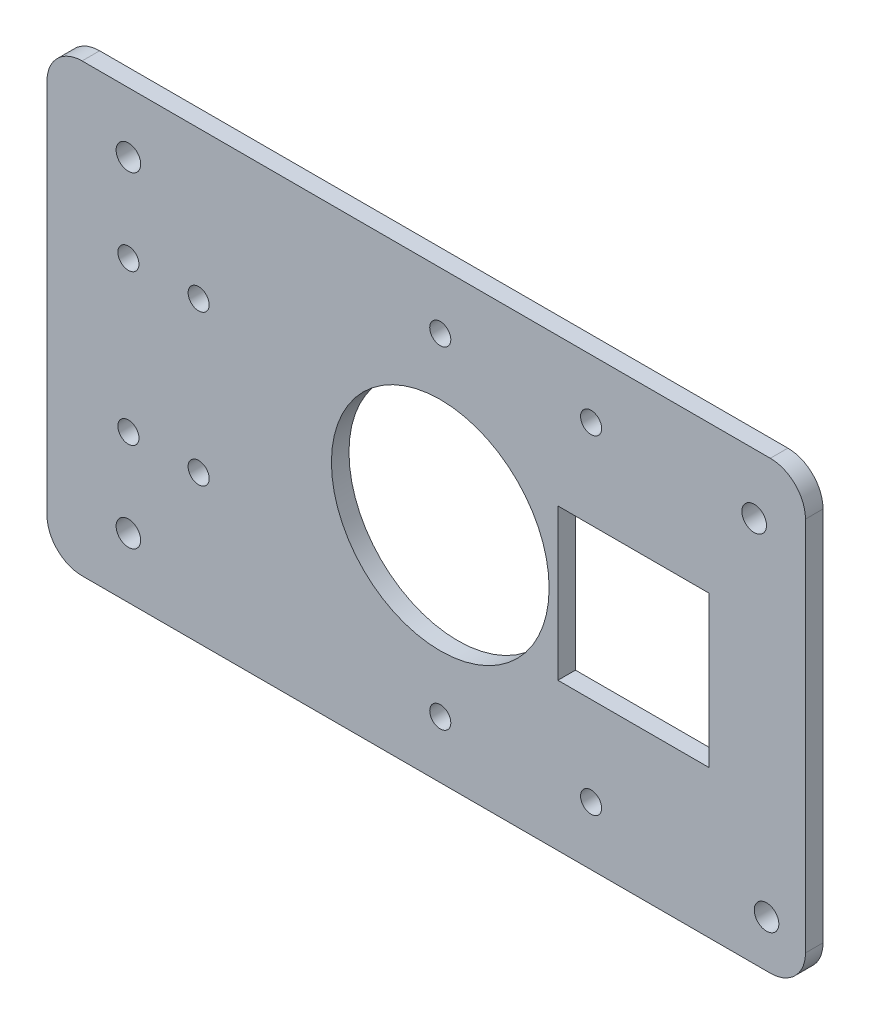
ISO-10303-21;
HEADER;
FILE_DESCRIPTION(('STEP AP214'),'2;1');
FILE_NAME('part.step','',(''),(''),'','','');
FILE_SCHEMA(('AUTOMOTIVE_DESIGN { 1 0 10303 214 1 1 1 1 }'));
ENDSEC;
DATA;
#1=APPLICATION_CONTEXT('core data for automotive mechanical design processes');
#2=APPLICATION_PROTOCOL_DEFINITION('international standard','automotive_design',2000,#1);
#3=PRODUCT_CONTEXT('',#1,'mechanical');
#4=PRODUCT('Part','Part','',(#3));
#5=PRODUCT_RELATED_PRODUCT_CATEGORY('part','',(#4));
#6=PRODUCT_DEFINITION_FORMATION('','',#4);
#7=PRODUCT_DEFINITION_CONTEXT('part definition',#1,'design');
#8=PRODUCT_DEFINITION('design','',#6,#7);
#9=PRODUCT_DEFINITION_SHAPE('','',#8);
#10=(LENGTH_UNIT() NAMED_UNIT(*) SI_UNIT(.MILLI.,.METRE.));
#11=(NAMED_UNIT(*) PLANE_ANGLE_UNIT() SI_UNIT($,.RADIAN.));
#12=(NAMED_UNIT(*) SI_UNIT($,.STERADIAN.) SOLID_ANGLE_UNIT());
#13=UNCERTAINTY_MEASURE_WITH_UNIT(LENGTH_MEASURE(1.E-05),#10,'distance_accuracy_value','');
#14=(GEOMETRIC_REPRESENTATION_CONTEXT(3) GLOBAL_UNCERTAINTY_ASSIGNED_CONTEXT((#13)) GLOBAL_UNIT_ASSIGNED_CONTEXT((#10,
#11,#12)) REPRESENTATION_CONTEXT('',''));
#15=CARTESIAN_POINT('',(0.,0.,0.));
#16=DIRECTION('',(0.,0.,1.));
#17=DIRECTION('',(1.,0.,0.));
#18=AXIS2_PLACEMENT_3D('',#15,#16,#17);
#19=CARTESIAN_POINT('',(0.,0.,10.));
#20=DIRECTION('',(0.,0.,-1.));
#21=DIRECTION('',(-1.,0.,0.));
#22=AXIS2_PLACEMENT_3D('',#19,#20,#21);
#23=PLANE('',#22);
#24=CARTESIAN_POINT('',(-98.,53.5,10.));
#25=DIRECTION('',(0.,0.,-1.));
#26=DIRECTION('',(-1.,0.,0.));
#27=AXIS2_PLACEMENT_3D('',#24,#25,#26);
#28=CIRCLE('',#27,10.);
#29=CARTESIAN_POINT('',(-98.,63.5,10.));
#30=VERTEX_POINT('',#29);
#31=CARTESIAN_POINT('',(-108.,53.5,10.));
#32=VERTEX_POINT('',#31);
#33=EDGE_CURVE('E173',#30,#32,#28,.F.);
#34=ORIENTED_EDGE('',*,*,#33,.T.);
#35=DIRECTION('',(0.,1.,0.));
#36=VECTOR('',#35,1.);
#37=CARTESIAN_POINT('',(-108.,63.5,10.));
#38=LINE('',#37,#36);
#39=CARTESIAN_POINT('',(-108.,-53.5,10.));
#40=VERTEX_POINT('',#39);
#41=EDGE_CURVE('E540',#40,#32,#38,.T.);
#42=ORIENTED_EDGE('',*,*,#41,.F.);
#43=CARTESIAN_POINT('',(-98.,-53.5,10.));
#44=DIRECTION('',(0.,0.,-1.));
#45=DIRECTION('',(-1.,0.,0.));
#46=AXIS2_PLACEMENT_3D('',#43,#44,#45);
#47=CIRCLE('',#46,10.);
#48=CARTESIAN_POINT('',(-98.,-63.5,10.));
#49=VERTEX_POINT('',#48);
#50=EDGE_CURVE('E177',#40,#49,#47,.F.);
#51=ORIENTED_EDGE('',*,*,#50,.T.);
#52=DIRECTION('',(-1.,0.,0.));
#53=VECTOR('',#52,1.);
#54=CARTESIAN_POINT('',(-108.,-63.5,10.));
#55=LINE('',#54,#53);
#56=CARTESIAN_POINT('',(98.,-63.5,10.));
#57=VERTEX_POINT('',#56);
#58=EDGE_CURVE('E244',#57,#49,#55,.T.);
#59=ORIENTED_EDGE('',*,*,#58,.F.);
#60=CARTESIAN_POINT('',(98.0000000000001,-53.5,10.));
#61=DIRECTION('',(0.,0.,-1.));
#62=DIRECTION('',(-1.,0.,0.));
#63=AXIS2_PLACEMENT_3D('',#60,#61,#62);
#64=CIRCLE('',#63,10.);
#65=CARTESIAN_POINT('',(108.,-53.5,10.));
#66=VERTEX_POINT('',#65);
#67=EDGE_CURVE('E183',#57,#66,#64,.F.);
#68=ORIENTED_EDGE('',*,*,#67,.T.);
#69=DIRECTION('',(0.,-1.,0.));
#70=VECTOR('',#69,1.);
#71=CARTESIAN_POINT('',(108.,63.5,10.));
#72=LINE('',#71,#70);
#73=CARTESIAN_POINT('',(108.,53.5,10.));
#74=VERTEX_POINT('',#73);
#75=EDGE_CURVE('E247',#74,#66,#72,.T.);
#76=ORIENTED_EDGE('',*,*,#75,.F.);
#77=CARTESIAN_POINT('',(98.,53.5,10.));
#78=DIRECTION('',(0.,0.,-1.));
#79=DIRECTION('',(-1.,0.,0.));
#80=AXIS2_PLACEMENT_3D('',#77,#78,#79);
#81=CIRCLE('',#80,10.);
#82=CARTESIAN_POINT('',(98.,63.5,10.));
#83=VERTEX_POINT('',#82);
#84=EDGE_CURVE('E180',#74,#83,#81,.F.);
#85=ORIENTED_EDGE('',*,*,#84,.T.);
#86=DIRECTION('',(1.,0.,0.));
#87=VECTOR('',#86,1.);
#88=CARTESIAN_POINT('',(-108.,63.5,10.));
#89=LINE('',#88,#87);
#90=EDGE_CURVE('E534',#30,#83,#89,.T.);
#91=ORIENTED_EDGE('',*,*,#90,.F.);
#92=EDGE_LOOP('',(#34,#42,#51,#59,#68,#76,#85,#91));
#93=FACE_BOUND('',#92,.T.);
#94=DIRECTION('',(-1.,0.,0.));
#95=VECTOR('',#94,1.);
#96=CARTESIAN_POINT('',(37.5000000000001,21.5,10.));
#97=LINE('',#96,#95);
#98=CARTESIAN_POINT('',(80.5000000000001,21.5,10.));
#99=VERTEX_POINT('',#98);
#100=CARTESIAN_POINT('',(37.5000000000001,21.5,10.));
#101=VERTEX_POINT('',#100);
#102=EDGE_CURVE('E138',#99,#101,#97,.T.);
#103=ORIENTED_EDGE('',*,*,#102,.F.);
#104=DIRECTION('',(0.,-1.,0.));
#105=VECTOR('',#104,1.);
#106=CARTESIAN_POINT('',(80.5000000000001,-21.5,10.));
#107=LINE('',#106,#105);
#108=CARTESIAN_POINT('',(80.5000000000001,-21.5,10.));
#109=VERTEX_POINT('',#108);
#110=EDGE_CURVE('E135',#99,#109,#107,.T.);
#111=ORIENTED_EDGE('',*,*,#110,.T.);
#112=DIRECTION('',(-1.,0.,0.));
#113=VECTOR('',#112,1.);
#114=CARTESIAN_POINT('',(37.5000000000001,-21.5,10.));
#115=LINE('',#114,#113);
#116=CARTESIAN_POINT('',(37.5000000000001,-21.5,10.));
#117=VERTEX_POINT('',#116);
#118=EDGE_CURVE('E124',#109,#117,#115,.T.);
#119=ORIENTED_EDGE('',*,*,#118,.T.);
#120=DIRECTION('',(0.,-1.,0.));
#121=VECTOR('',#120,1.);
#122=CARTESIAN_POINT('',(37.5000000000001,-21.5,10.));
#123=LINE('',#122,#121);
#124=EDGE_CURVE('E234',#101,#117,#123,.T.);
#125=ORIENTED_EDGE('',*,*,#124,.F.);
#126=EDGE_LOOP('',(#103,#111,#119,#125));
#127=FACE_BOUND('',#126,.T.);
#128=CARTESIAN_POINT('',(-84.8116679666902,46.37,10.));
#129=DIRECTION('',(0.,0.,-1.));
#130=DIRECTION('',(-1.,0.,0.));
#131=AXIS2_PLACEMENT_3D('',#128,#129,#130);
#132=CIRCLE('',#131,3.50000000000001);
#133=CARTESIAN_POINT('',(-88.3116679666902,46.37,10.));
#134=VERTEX_POINT('',#133);
#135=EDGE_CURVE('E233',#134,#134,#132,.F.);
#136=ORIENTED_EDGE('',*,*,#135,.F.);
#137=EDGE_LOOP('',(#136));
#138=FACE_BOUND('',#137,.T.);
#139=CARTESIAN_POINT('',(96.9145553930181,-50.1725670547442,10.));
#140=DIRECTION('',(0.,0.,-1.));
#141=DIRECTION('',(-1.,0.,0.));
#142=AXIS2_PLACEMENT_3D('',#139,#140,#141);
#143=CIRCLE('',#142,3.50000000000001);
#144=CARTESIAN_POINT('',(93.4145553930181,-50.1725670547442,10.));
#145=VERTEX_POINT('',#144);
#146=EDGE_CURVE('E555',#145,#145,#143,.F.);
#147=ORIENTED_EDGE('',*,*,#146,.F.);
#148=EDGE_LOOP('',(#147));
#149=FACE_BOUND('',#148,.T.);
#150=CARTESIAN_POINT('',(4.00000000000006,47.25,10.));
#151=DIRECTION('',(0.,0.,-1.));
#152=DIRECTION('',(-1.,0.,0.));
#153=AXIS2_PLACEMENT_3D('',#150,#151,#152);
#154=CIRCLE('',#153,3.);
#155=CARTESIAN_POINT('',(1.00000000000006,47.25,10.));
#156=VERTEX_POINT('',#155);
#157=EDGE_CURVE('E231',#156,#156,#154,.F.);
#158=ORIENTED_EDGE('',*,*,#157,.F.);
#159=EDGE_LOOP('',(#158));
#160=FACE_BOUND('',#159,.T.);
#161=CARTESIAN_POINT('',(46.9495287272827,-46.81,10.));
#162=DIRECTION('',(0.,0.,-1.));
#163=DIRECTION('',(-1.,0.,0.));
#164=AXIS2_PLACEMENT_3D('',#161,#162,#163);
#165=CIRCLE('',#164,2.99999999999999);
#166=CARTESIAN_POINT('',(43.9495287272827,-46.81,10.));
#167=VERTEX_POINT('',#166);
#168=EDGE_CURVE('E187',#167,#167,#165,.T.);
#169=ORIENTED_EDGE('',*,*,#168,.T.);
#170=EDGE_LOOP('',(#169));
#171=FACE_BOUND('',#170,.T.);
#172=CARTESIAN_POINT('',(-84.8116679666902,21.435,10.));
#173=DIRECTION('',(0.,0.,-1.));
#174=DIRECTION('',(-1.,0.,0.));
#175=AXIS2_PLACEMENT_3D('',#172,#173,#174);
#176=CIRCLE('',#175,2.99999999999999);
#177=CARTESIAN_POINT('',(-87.8116679666901,21.435,10.));
#178=VERTEX_POINT('',#177);
#179=EDGE_CURVE('E226',#178,#178,#176,.F.);
#180=ORIENTED_EDGE('',*,*,#179,.F.);
#181=EDGE_LOOP('',(#180));
#182=FACE_BOUND('',#181,.T.);
#183=CARTESIAN_POINT('',(-84.8116679666902,-21.435,10.));
#184=DIRECTION('',(0.,0.,-1.));
#185=DIRECTION('',(-1.,0.,0.));
#186=AXIS2_PLACEMENT_3D('',#183,#184,#185);
#187=CIRCLE('',#186,2.99999999999999);
#188=CARTESIAN_POINT('',(-87.8116679666901,-21.435,10.));
#189=VERTEX_POINT('',#188);
#190=EDGE_CURVE('E37',#189,#189,#187,.T.);
#191=ORIENTED_EDGE('',*,*,#190,.T.);
#192=EDGE_LOOP('',(#191));
#193=FACE_BOUND('',#192,.T.);
#194=CARTESIAN_POINT('',(4.00000000000006,-47.25,10.));
#195=DIRECTION('',(0.,0.,-1.));
#196=DIRECTION('',(-1.,0.,0.));
#197=AXIS2_PLACEMENT_3D('',#194,#195,#196);
#198=CIRCLE('',#197,3.);
#199=CARTESIAN_POINT('',(1.00000000000006,-47.25,10.));
#200=VERTEX_POINT('',#199);
#201=EDGE_CURVE('E195',#200,#200,#198,.T.);
#202=ORIENTED_EDGE('',*,*,#201,.T.);
#203=EDGE_LOOP('',(#202));
#204=FACE_BOUND('',#203,.T.);
#205=CARTESIAN_POINT('',(-64.8116679666902,21.4349999999999,10.));
#206=DIRECTION('',(0.,0.,-1.));
#207=DIRECTION('',(-1.,0.,0.));
#208=AXIS2_PLACEMENT_3D('',#205,#206,#207);
#209=CIRCLE('',#208,2.99999999999999);
#210=CARTESIAN_POINT('',(-67.8116679666901,21.4349999999999,10.));
#211=VERTEX_POINT('',#210);
#212=EDGE_CURVE('E218',#211,#211,#209,.F.);
#213=ORIENTED_EDGE('',*,*,#212,.F.);
#214=EDGE_LOOP('',(#213));
#215=FACE_BOUND('',#214,.T.);
#216=CARTESIAN_POINT('',(-64.8116679666902,-21.4350000000001,10.));
#217=DIRECTION('',(0.,0.,-1.));
#218=DIRECTION('',(-1.,0.,0.));
#219=AXIS2_PLACEMENT_3D('',#216,#217,#218);
#220=CIRCLE('',#219,2.99999999999999);
#221=CARTESIAN_POINT('',(-67.8116679666901,-21.4350000000001,10.));
#222=VERTEX_POINT('',#221);
#223=EDGE_CURVE('E192',#222,#222,#220,.T.);
#224=ORIENTED_EDGE('',*,*,#223,.T.);
#225=EDGE_LOOP('',(#224));
#226=FACE_BOUND('',#225,.T.);
#227=CARTESIAN_POINT('',(46.9495287272827,46.81,10.));
#228=DIRECTION('',(0.,0.,-1.));
#229=DIRECTION('',(-1.,0.,0.));
#230=AXIS2_PLACEMENT_3D('',#227,#228,#229);
#231=CIRCLE('',#230,2.99999999999999);
#232=CARTESIAN_POINT('',(43.9495287272827,46.81,10.));
#233=VERTEX_POINT('',#232);
#234=EDGE_CURVE('E227',#233,#233,#231,.F.);
#235=ORIENTED_EDGE('',*,*,#234,.F.);
#236=EDGE_LOOP('',(#235));
#237=FACE_BOUND('',#236,.T.);
#238=CARTESIAN_POINT('',(93.3990574545653,46.37,10.));
#239=DIRECTION('',(0.,0.,-1.));
#240=DIRECTION('',(-1.,0.,0.));
#241=AXIS2_PLACEMENT_3D('',#238,#239,#240);
#242=CIRCLE('',#241,3.50000000000001);
#243=CARTESIAN_POINT('',(89.8990574545653,46.37,10.));
#244=VERTEX_POINT('',#243);
#245=EDGE_CURVE('E558',#244,#244,#242,.F.);
#246=ORIENTED_EDGE('',*,*,#245,.F.);
#247=EDGE_LOOP('',(#246));
#248=FACE_BOUND('',#247,.T.);
#249=CARTESIAN_POINT('',(-84.8116679666902,-46.37,10.));
#250=DIRECTION('',(0.,0.,-1.));
#251=DIRECTION('',(-1.,0.,0.));
#252=AXIS2_PLACEMENT_3D('',#249,#250,#251);
#253=CIRCLE('',#252,3.50000000000001);
#254=CARTESIAN_POINT('',(-88.3116679666902,-46.37,10.));
#255=VERTEX_POINT('',#254);
#256=EDGE_CURVE('E552',#255,#255,#253,.F.);
#257=ORIENTED_EDGE('',*,*,#256,.F.);
#258=EDGE_LOOP('',(#257));
#259=FACE_BOUND('',#258,.T.);
#260=CARTESIAN_POINT('',(4.00000000000006,0.,10.));
#261=DIRECTION('',(0.,0.,-1.));
#262=DIRECTION('',(-1.,0.,0.));
#263=AXIS2_PLACEMENT_3D('',#260,#261,#262);
#264=CIRCLE('',#263,31.);
#265=CARTESIAN_POINT('',(-26.9999999999999,0.,10.));
#266=VERTEX_POINT('',#265);
#267=EDGE_CURVE('E237',#266,#266,#264,.F.);
#268=ORIENTED_EDGE('',*,*,#267,.F.);
#269=EDGE_LOOP('',(#268));
#270=FACE_BOUND('',#269,.T.);
#271=ADVANCED_FACE('F33',(#93,#127,#138,#149,#160,#171,#182,#193,#204,#215,#226,#237,#248,#259,
#270),#23,.F.);
#272=CARTESIAN_POINT('',(0.,0.,5.));
#273=DIRECTION('',(0.,0.,-1.));
#274=DIRECTION('',(-1.,0.,0.));
#275=AXIS2_PLACEMENT_3D('',#272,#273,#274);
#276=PLANE('',#275);
#277=CARTESIAN_POINT('',(4.00000000000006,0.,5.));
#278=DIRECTION('',(0.,0.,-1.));
#279=DIRECTION('',(-1.,0.,0.));
#280=AXIS2_PLACEMENT_3D('',#277,#278,#279);
#281=CIRCLE('',#280,31.);
#282=CARTESIAN_POINT('',(-26.9999999999999,0.,5.));
#283=VERTEX_POINT('',#282);
#284=EDGE_CURVE('E185',#283,#283,#281,.F.);
#285=ORIENTED_EDGE('',*,*,#284,.T.);
#286=EDGE_LOOP('',(#285));
#287=FACE_BOUND('',#286,.T.);
#288=CARTESIAN_POINT('',(-84.8116679666902,-46.37,5.));
#289=DIRECTION('',(0.,0.,-1.));
#290=DIRECTION('',(-1.,0.,0.));
#291=AXIS2_PLACEMENT_3D('',#288,#289,#290);
#292=CIRCLE('',#291,3.50000000000001);
#293=CARTESIAN_POINT('',(-88.3116679666902,-46.37,5.));
#294=VERTEX_POINT('',#293);
#295=EDGE_CURVE('E265',#294,#294,#292,.F.);
#296=ORIENTED_EDGE('',*,*,#295,.T.);
#297=EDGE_LOOP('',(#296));
#298=FACE_BOUND('',#297,.T.);
#299=CARTESIAN_POINT('',(93.3990574545653,46.37,5.));
#300=DIRECTION('',(0.,0.,-1.));
#301=DIRECTION('',(-1.,0.,0.));
#302=AXIS2_PLACEMENT_3D('',#299,#300,#301);
#303=CIRCLE('',#302,3.50000000000001);
#304=CARTESIAN_POINT('',(89.8990574545653,46.37,5.));
#305=VERTEX_POINT('',#304);
#306=EDGE_CURVE('E271',#305,#305,#303,.F.);
#307=ORIENTED_EDGE('',*,*,#306,.T.);
#308=EDGE_LOOP('',(#307));
#309=FACE_BOUND('',#308,.T.);
#310=CARTESIAN_POINT('',(46.9495287272827,46.81,5.));
#311=DIRECTION('',(0.,0.,-1.));
#312=DIRECTION('',(-1.,0.,0.));
#313=AXIS2_PLACEMENT_3D('',#310,#311,#312);
#314=CIRCLE('',#313,2.99999999999999);
#315=CARTESIAN_POINT('',(43.9495287272827,46.81,5.));
#316=VERTEX_POINT('',#315);
#317=EDGE_CURVE('E191',#316,#316,#314,.F.);
#318=ORIENTED_EDGE('',*,*,#317,.T.);
#319=EDGE_LOOP('',(#318));
#320=FACE_BOUND('',#319,.T.);
#321=CARTESIAN_POINT('',(-64.8116679666902,-21.4350000000001,5.));
#322=DIRECTION('',(0.,0.,-1.));
#323=DIRECTION('',(-1.,0.,0.));
#324=AXIS2_PLACEMENT_3D('',#321,#322,#323);
#325=CIRCLE('',#324,2.99999999999999);
#326=CARTESIAN_POINT('',(-67.8116679666901,-21.4350000000001,5.));
#327=VERTEX_POINT('',#326);
#328=EDGE_CURVE('E223',#327,#327,#325,.T.);
#329=ORIENTED_EDGE('',*,*,#328,.F.);
#330=EDGE_LOOP('',(#329));
#331=FACE_BOUND('',#330,.T.);
#332=CARTESIAN_POINT('',(-64.8116679666902,21.4349999999999,5.));
#333=DIRECTION('',(0.,0.,-1.));
#334=DIRECTION('',(-1.,0.,0.));
#335=AXIS2_PLACEMENT_3D('',#332,#333,#334);
#336=CIRCLE('',#335,2.99999999999999);
#337=CARTESIAN_POINT('',(-67.8116679666901,21.4349999999999,5.));
#338=VERTEX_POINT('',#337);
#339=EDGE_CURVE('E197',#338,#338,#336,.F.);
#340=ORIENTED_EDGE('',*,*,#339,.T.);
#341=EDGE_LOOP('',(#340));
#342=FACE_BOUND('',#341,.T.);
#343=CARTESIAN_POINT('',(4.00000000000006,-47.25,5.));
#344=DIRECTION('',(0.,0.,-1.));
#345=DIRECTION('',(-1.,0.,0.));
#346=AXIS2_PLACEMENT_3D('',#343,#344,#345);
#347=CIRCLE('',#346,3.);
#348=CARTESIAN_POINT('',(1.00000000000006,-47.25,5.));
#349=VERTEX_POINT('',#348);
#350=EDGE_CURVE('E215',#349,#349,#347,.T.);
#351=ORIENTED_EDGE('',*,*,#350,.F.);
#352=EDGE_LOOP('',(#351));
#353=FACE_BOUND('',#352,.T.);
#354=CARTESIAN_POINT('',(-84.8116679666902,-21.435,5.));
#355=DIRECTION('',(0.,0.,-1.));
#356=DIRECTION('',(-1.,0.,0.));
#357=AXIS2_PLACEMENT_3D('',#354,#355,#356);
#358=CIRCLE('',#357,2.99999999999999);
#359=CARTESIAN_POINT('',(-87.8116679666901,-21.435,5.));
#360=VERTEX_POINT('',#359);
#361=EDGE_CURVE('E171',#360,#360,#358,.T.);
#362=ORIENTED_EDGE('',*,*,#361,.F.);
#363=EDGE_LOOP('',(#362));
#364=FACE_BOUND('',#363,.T.);
#365=CARTESIAN_POINT('',(-84.8116679666902,21.435,5.));
#366=DIRECTION('',(0.,0.,-1.));
#367=DIRECTION('',(-1.,0.,0.));
#368=AXIS2_PLACEMENT_3D('',#365,#366,#367);
#369=CIRCLE('',#368,2.99999999999999);
#370=CARTESIAN_POINT('',(-87.8116679666901,21.435,5.));
#371=VERTEX_POINT('',#370);
#372=EDGE_CURVE('E194',#371,#371,#369,.F.);
#373=ORIENTED_EDGE('',*,*,#372,.T.);
#374=EDGE_LOOP('',(#373));
#375=FACE_BOUND('',#374,.T.);
#376=CARTESIAN_POINT('',(46.9495287272827,-46.81,5.));
#377=DIRECTION('',(0.,0.,-1.));
#378=DIRECTION('',(-1.,0.,0.));
#379=AXIS2_PLACEMENT_3D('',#376,#377,#378);
#380=CIRCLE('',#379,2.99999999999999);
#381=CARTESIAN_POINT('',(43.9495287272827,-46.81,5.));
#382=VERTEX_POINT('',#381);
#383=EDGE_CURVE('E228',#382,#382,#380,.T.);
#384=ORIENTED_EDGE('',*,*,#383,.F.);
#385=EDGE_LOOP('',(#384));
#386=FACE_BOUND('',#385,.T.);
#387=CARTESIAN_POINT('',(4.00000000000006,47.25,5.));
#388=DIRECTION('',(0.,0.,-1.));
#389=DIRECTION('',(-1.,0.,0.));
#390=AXIS2_PLACEMENT_3D('',#387,#388,#389);
#391=CIRCLE('',#390,3.);
#392=CARTESIAN_POINT('',(1.00000000000006,47.25,5.));
#393=VERTEX_POINT('',#392);
#394=EDGE_CURVE('E190',#393,#393,#391,.F.);
#395=ORIENTED_EDGE('',*,*,#394,.T.);
#396=EDGE_LOOP('',(#395));
#397=FACE_BOUND('',#396,.T.);
#398=CARTESIAN_POINT('',(96.9145553930181,-50.1725670547442,5.));
#399=DIRECTION('',(0.,0.,-1.));
#400=DIRECTION('',(-1.,0.,0.));
#401=AXIS2_PLACEMENT_3D('',#398,#399,#400);
#402=CIRCLE('',#401,3.50000000000001);
#403=CARTESIAN_POINT('',(93.4145553930181,-50.1725670547442,5.));
#404=VERTEX_POINT('',#403);
#405=EDGE_CURVE('E268',#404,#404,#402,.F.);
#406=ORIENTED_EDGE('',*,*,#405,.T.);
#407=EDGE_LOOP('',(#406));
#408=FACE_BOUND('',#407,.T.);
#409=CARTESIAN_POINT('',(-84.8116679666902,46.37,5.));
#410=DIRECTION('',(0.,0.,-1.));
#411=DIRECTION('',(-1.,0.,0.));
#412=AXIS2_PLACEMENT_3D('',#409,#410,#411);
#413=CIRCLE('',#412,3.50000000000001);
#414=CARTESIAN_POINT('',(-88.3116679666902,46.37,5.));
#415=VERTEX_POINT('',#414);
#416=EDGE_CURVE('E141',#415,#415,#413,.F.);
#417=ORIENTED_EDGE('',*,*,#416,.T.);
#418=EDGE_LOOP('',(#417));
#419=FACE_BOUND('',#418,.T.);
#420=DIRECTION('',(-1.,0.,0.));
#421=VECTOR('',#420,1.);
#422=CARTESIAN_POINT('',(37.5000000000001,21.5,5.));
#423=LINE('',#422,#421);
#424=CARTESIAN_POINT('',(80.5000000000001,21.5,5.));
#425=VERTEX_POINT('',#424);
#426=CARTESIAN_POINT('',(37.5000000000001,21.5,5.));
#427=VERTEX_POINT('',#426);
#428=EDGE_CURVE('E131',#425,#427,#423,.T.);
#429=ORIENTED_EDGE('',*,*,#428,.T.);
#430=DIRECTION('',(0.,-1.,0.));
#431=VECTOR('',#430,1.);
#432=CARTESIAN_POINT('',(37.5000000000001,-21.5,5.));
#433=LINE('',#432,#431);
#434=CARTESIAN_POINT('',(37.5000000000001,-21.5,5.));
#435=VERTEX_POINT('',#434);
#436=EDGE_CURVE('E140',#427,#435,#433,.T.);
#437=ORIENTED_EDGE('',*,*,#436,.T.);
#438=DIRECTION('',(-1.,0.,0.));
#439=VECTOR('',#438,1.);
#440=CARTESIAN_POINT('',(37.5000000000001,-21.5,5.));
#441=LINE('',#440,#439);
#442=CARTESIAN_POINT('',(80.5000000000001,-21.5,5.));
#443=VERTEX_POINT('',#442);
#444=EDGE_CURVE('E245',#443,#435,#441,.T.);
#445=ORIENTED_EDGE('',*,*,#444,.F.);
#446=DIRECTION('',(0.,-1.,0.));
#447=VECTOR('',#446,1.);
#448=CARTESIAN_POINT('',(80.5000000000001,-21.5,5.));
#449=LINE('',#448,#447);
#450=EDGE_CURVE('E50',#425,#443,#449,.T.);
#451=ORIENTED_EDGE('',*,*,#450,.F.);
#452=EDGE_LOOP('',(#429,#437,#445,#451));
#453=FACE_BOUND('',#452,.T.);
#454=CARTESIAN_POINT('',(-98.,53.5,5.));
#455=DIRECTION('',(0.,0.,-1.));
#456=DIRECTION('',(-1.,0.,0.));
#457=AXIS2_PLACEMENT_3D('',#454,#455,#456);
#458=CIRCLE('',#457,10.);
#459=CARTESIAN_POINT('',(-98.,63.5,5.));
#460=VERTEX_POINT('',#459);
#461=CARTESIAN_POINT('',(-108.,53.5,5.));
#462=VERTEX_POINT('',#461);
#463=EDGE_CURVE('E242',#460,#462,#458,.F.);
#464=ORIENTED_EDGE('',*,*,#463,.F.);
#465=DIRECTION('',(1.,0.,0.));
#466=VECTOR('',#465,1.);
#467=CARTESIAN_POINT('',(-108.,63.5,5.));
#468=LINE('',#467,#466);
#469=CARTESIAN_POINT('',(98.,63.5,5.));
#470=VERTEX_POINT('',#469);
#471=EDGE_CURVE('E251',#460,#470,#468,.T.);
#472=ORIENTED_EDGE('',*,*,#471,.T.);
#473=CARTESIAN_POINT('',(98.,53.5,5.));
#474=DIRECTION('',(0.,0.,-1.));
#475=DIRECTION('',(-1.,0.,0.));
#476=AXIS2_PLACEMENT_3D('',#473,#474,#475);
#477=CIRCLE('',#476,10.);
#478=CARTESIAN_POINT('',(108.,53.5,5.));
#479=VERTEX_POINT('',#478);
#480=EDGE_CURVE('E238',#479,#470,#477,.F.);
#481=ORIENTED_EDGE('',*,*,#480,.F.);
#482=DIRECTION('',(0.,-1.,0.));
#483=VECTOR('',#482,1.);
#484=CARTESIAN_POINT('',(108.,63.5,5.));
#485=LINE('',#484,#483);
#486=CARTESIAN_POINT('',(108.,-53.5,5.));
#487=VERTEX_POINT('',#486);
#488=EDGE_CURVE('E132',#479,#487,#485,.T.);
#489=ORIENTED_EDGE('',*,*,#488,.T.);
#490=CARTESIAN_POINT('',(98.0000000000001,-53.5,5.));
#491=DIRECTION('',(0.,0.,-1.));
#492=DIRECTION('',(-1.,0.,0.));
#493=AXIS2_PLACEMENT_3D('',#490,#491,#492);
#494=CIRCLE('',#493,10.);
#495=CARTESIAN_POINT('',(98.,-63.5,5.));
#496=VERTEX_POINT('',#495);
#497=EDGE_CURVE('E235',#496,#487,#494,.F.);
#498=ORIENTED_EDGE('',*,*,#497,.F.);
#499=DIRECTION('',(-1.,0.,0.));
#500=VECTOR('',#499,1.);
#501=CARTESIAN_POINT('',(-108.,-63.5,5.));
#502=LINE('',#501,#500);
#503=CARTESIAN_POINT('',(-98.,-63.5,5.));
#504=VERTEX_POINT('',#503);
#505=EDGE_CURVE('E176',#496,#504,#502,.T.);
#506=ORIENTED_EDGE('',*,*,#505,.T.);
#507=CARTESIAN_POINT('',(-98.,-53.5,5.));
#508=DIRECTION('',(0.,0.,-1.));
#509=DIRECTION('',(-1.,0.,0.));
#510=AXIS2_PLACEMENT_3D('',#507,#508,#509);
#511=CIRCLE('',#510,10.);
#512=CARTESIAN_POINT('',(-108.,-53.5,5.));
#513=VERTEX_POINT('',#512);
#514=EDGE_CURVE('E240',#513,#504,#511,.F.);
#515=ORIENTED_EDGE('',*,*,#514,.F.);
#516=DIRECTION('',(0.,1.,0.));
#517=VECTOR('',#516,1.);
#518=CARTESIAN_POINT('',(-108.,63.5,5.));
#519=LINE('',#518,#517);
#520=EDGE_CURVE('E254',#513,#462,#519,.T.);
#521=ORIENTED_EDGE('',*,*,#520,.T.);
#522=EDGE_LOOP('',(#464,#472,#481,#489,#498,#506,#515,#521));
#523=FACE_BOUND('',#522,.T.);
#524=ADVANCED_FACE('F210',(#287,#298,#309,#320,#331,#342,#353,#364,#375,#386,#397,#408,#419,
#453,#523),#276,.T.);
#525=CARTESIAN_POINT('',(-84.8116679666902,-21.435,25.));
#526=DIRECTION('',(0.,0.,-1.));
#527=DIRECTION('',(-1.,0.,0.));
#528=AXIS2_PLACEMENT_3D('',#525,#526,#527);
#529=CYLINDRICAL_SURFACE('',#528,2.99999999999999);
#530=ORIENTED_EDGE('',*,*,#190,.F.);
#531=EDGE_LOOP('',(#530));
#532=FACE_BOUND('',#531,.T.);
#533=ORIENTED_EDGE('',*,*,#361,.T.);
#534=EDGE_LOOP('',(#533));
#535=FACE_BOUND('',#534,.T.);
#536=ADVANCED_FACE('F206',(#532,#535),#529,.F.);
#537=CARTESIAN_POINT('',(4.00000000000006,-47.25,25.));
#538=DIRECTION('',(0.,0.,-1.));
#539=DIRECTION('',(-1.,0.,0.));
#540=AXIS2_PLACEMENT_3D('',#537,#538,#539);
#541=CYLINDRICAL_SURFACE('',#540,3.);
#542=ORIENTED_EDGE('',*,*,#201,.F.);
#543=EDGE_LOOP('',(#542));
#544=FACE_BOUND('',#543,.T.);
#545=ORIENTED_EDGE('',*,*,#350,.T.);
#546=EDGE_LOOP('',(#545));
#547=FACE_BOUND('',#546,.T.);
#548=ADVANCED_FACE('F209',(#544,#547),#541,.F.);
#549=CARTESIAN_POINT('',(-64.8116679666902,21.4349999999999,25.));
#550=DIRECTION('',(0.,0.,-1.));
#551=DIRECTION('',(-1.,0.,0.));
#552=AXIS2_PLACEMENT_3D('',#549,#550,#551);
#553=CYLINDRICAL_SURFACE('',#552,2.99999999999999);
#554=ORIENTED_EDGE('',*,*,#212,.T.);
#555=EDGE_LOOP('',(#554));
#556=FACE_BOUND('',#555,.T.);
#557=ORIENTED_EDGE('',*,*,#339,.F.);
#558=EDGE_LOOP('',(#557));
#559=FACE_BOUND('',#558,.T.);
#560=ADVANCED_FACE('F286',(#556,#559),#553,.F.);
#561=CARTESIAN_POINT('',(-84.8116679666902,21.435,25.));
#562=DIRECTION('',(0.,0.,-1.));
#563=DIRECTION('',(-1.,0.,0.));
#564=AXIS2_PLACEMENT_3D('',#561,#562,#563);
#565=CYLINDRICAL_SURFACE('',#564,2.99999999999999);
#566=ORIENTED_EDGE('',*,*,#179,.T.);
#567=EDGE_LOOP('',(#566));
#568=FACE_BOUND('',#567,.T.);
#569=ORIENTED_EDGE('',*,*,#372,.F.);
#570=EDGE_LOOP('',(#569));
#571=FACE_BOUND('',#570,.T.);
#572=ADVANCED_FACE('F283',(#568,#571),#565,.F.);
#573=CARTESIAN_POINT('',(-64.8116679666902,-21.4350000000001,25.));
#574=DIRECTION('',(0.,0.,-1.));
#575=DIRECTION('',(-1.,0.,0.));
#576=AXIS2_PLACEMENT_3D('',#573,#574,#575);
#577=CYLINDRICAL_SURFACE('',#576,2.99999999999999);
#578=ORIENTED_EDGE('',*,*,#223,.F.);
#579=EDGE_LOOP('',(#578));
#580=FACE_BOUND('',#579,.T.);
#581=ORIENTED_EDGE('',*,*,#328,.T.);
#582=EDGE_LOOP('',(#581));
#583=FACE_BOUND('',#582,.T.);
#584=ADVANCED_FACE('F285',(#580,#583),#577,.F.);
#585=CARTESIAN_POINT('',(46.9495287272827,46.81,25.));
#586=DIRECTION('',(0.,0.,-1.));
#587=DIRECTION('',(-1.,0.,0.));
#588=AXIS2_PLACEMENT_3D('',#585,#586,#587);
#589=CYLINDRICAL_SURFACE('',#588,2.99999999999999);
#590=ORIENTED_EDGE('',*,*,#234,.T.);
#591=EDGE_LOOP('',(#590));
#592=FACE_BOUND('',#591,.T.);
#593=ORIENTED_EDGE('',*,*,#317,.F.);
#594=EDGE_LOOP('',(#593));
#595=FACE_BOUND('',#594,.T.);
#596=ADVANCED_FACE('F293',(#592,#595),#589,.F.);
#597=CARTESIAN_POINT('',(46.9495287272827,-46.81,25.));
#598=DIRECTION('',(0.,0.,-1.));
#599=DIRECTION('',(-1.,0.,0.));
#600=AXIS2_PLACEMENT_3D('',#597,#598,#599);
#601=CYLINDRICAL_SURFACE('',#600,2.99999999999999);
#602=ORIENTED_EDGE('',*,*,#168,.F.);
#603=EDGE_LOOP('',(#602));
#604=FACE_BOUND('',#603,.T.);
#605=ORIENTED_EDGE('',*,*,#383,.T.);
#606=EDGE_LOOP('',(#605));
#607=FACE_BOUND('',#606,.T.);
#608=ADVANCED_FACE('F340',(#604,#607),#601,.F.);
#609=CARTESIAN_POINT('',(4.00000000000006,47.25,25.));
#610=DIRECTION('',(0.,0.,-1.));
#611=DIRECTION('',(-1.,0.,0.));
#612=AXIS2_PLACEMENT_3D('',#609,#610,#611);
#613=CYLINDRICAL_SURFACE('',#612,3.);
#614=ORIENTED_EDGE('',*,*,#157,.T.);
#615=EDGE_LOOP('',(#614));
#616=FACE_BOUND('',#615,.T.);
#617=ORIENTED_EDGE('',*,*,#394,.F.);
#618=EDGE_LOOP('',(#617));
#619=FACE_BOUND('',#618,.T.);
#620=ADVANCED_FACE('F350',(#616,#619),#613,.F.);
#621=CARTESIAN_POINT('',(93.3990574545653,46.37,-60.84));
#622=DIRECTION('',(0.,0.,1.));
#623=DIRECTION('',(1.,0.,0.));
#624=AXIS2_PLACEMENT_3D('',#621,#622,#623);
#625=CYLINDRICAL_SURFACE('',#624,3.50000000000001);
#626=ORIENTED_EDGE('',*,*,#245,.T.);
#627=EDGE_LOOP('',(#626));
#628=FACE_BOUND('',#627,.T.);
#629=ORIENTED_EDGE('',*,*,#306,.F.);
#630=EDGE_LOOP('',(#629));
#631=FACE_BOUND('',#630,.T.);
#632=ADVANCED_FACE('F360',(#628,#631),#625,.F.);
#633=CARTESIAN_POINT('',(96.9145553930181,-50.1725670547442,-60.84));
#634=DIRECTION('',(0.,0.,1.));
#635=DIRECTION('',(1.,0.,0.));
#636=AXIS2_PLACEMENT_3D('',#633,#634,#635);
#637=CYLINDRICAL_SURFACE('',#636,3.50000000000001);
#638=ORIENTED_EDGE('',*,*,#146,.T.);
#639=EDGE_LOOP('',(#638));
#640=FACE_BOUND('',#639,.T.);
#641=ORIENTED_EDGE('',*,*,#405,.F.);
#642=EDGE_LOOP('',(#641));
#643=FACE_BOUND('',#642,.T.);
#644=ADVANCED_FACE('F370',(#640,#643),#637,.F.);
#645=CARTESIAN_POINT('',(-84.8116679666902,-46.37,-60.84));
#646=DIRECTION('',(0.,0.,1.));
#647=DIRECTION('',(1.,0.,0.));
#648=AXIS2_PLACEMENT_3D('',#645,#646,#647);
#649=CYLINDRICAL_SURFACE('',#648,3.50000000000001);
#650=ORIENTED_EDGE('',*,*,#256,.T.);
#651=EDGE_LOOP('',(#650));
#652=FACE_BOUND('',#651,.T.);
#653=ORIENTED_EDGE('',*,*,#295,.F.);
#654=EDGE_LOOP('',(#653));
#655=FACE_BOUND('',#654,.T.);
#656=ADVANCED_FACE('F380',(#652,#655),#649,.F.);
#657=CARTESIAN_POINT('',(-84.8116679666902,46.37,-60.84));
#658=DIRECTION('',(0.,0.,1.));
#659=DIRECTION('',(1.,0.,0.));
#660=AXIS2_PLACEMENT_3D('',#657,#658,#659);
#661=CYLINDRICAL_SURFACE('',#660,3.50000000000001);
#662=ORIENTED_EDGE('',*,*,#135,.T.);
#663=EDGE_LOOP('',(#662));
#664=FACE_BOUND('',#663,.T.);
#665=ORIENTED_EDGE('',*,*,#416,.F.);
#666=EDGE_LOOP('',(#665));
#667=FACE_BOUND('',#666,.T.);
#668=ADVANCED_FACE('F390',(#664,#667),#661,.F.);
#669=CARTESIAN_POINT('',(37.5000000000001,-21.5,25.));
#670=DIRECTION('',(0.,1.,0.));
#671=DIRECTION('',(-1.,0.,0.));
#672=AXIS2_PLACEMENT_3D('',#669,#670,#671);
#673=PLANE('',#672);
#674=ORIENTED_EDGE('',*,*,#118,.F.);
#675=DIRECTION('',(0.,0.,-1.));
#676=VECTOR('',#675,1.);
#677=CARTESIAN_POINT('',(80.5000000000001,-21.5,25.));
#678=LINE('',#677,#676);
#679=EDGE_CURVE('E128',#109,#443,#678,.T.);
#680=ORIENTED_EDGE('',*,*,#679,.T.);
#681=ORIENTED_EDGE('',*,*,#444,.T.);
#682=DIRECTION('',(0.,0.,-1.));
#683=VECTOR('',#682,1.);
#684=CARTESIAN_POINT('',(37.5000000000001,-21.5,25.));
#685=LINE('',#684,#683);
#686=EDGE_CURVE('E129',#117,#435,#685,.T.);
#687=ORIENTED_EDGE('',*,*,#686,.F.);
#688=EDGE_LOOP('',(#674,#680,#681,#687));
#689=FACE_BOUND('',#688,.T.);
#690=ADVANCED_FACE('F126',(#689),#673,.T.);
#691=CARTESIAN_POINT('',(37.5000000000001,21.5,25.));
#692=DIRECTION('',(0.,1.,0.));
#693=DIRECTION('',(-1.,0.,0.));
#694=AXIS2_PLACEMENT_3D('',#691,#692,#693);
#695=PLANE('',#694);
#696=DIRECTION('',(0.,0.,-1.));
#697=VECTOR('',#696,1.);
#698=CARTESIAN_POINT('',(80.5000000000001,21.5,25.));
#699=LINE('',#698,#697);
#700=EDGE_CURVE('E42',#99,#425,#699,.T.);
#701=ORIENTED_EDGE('',*,*,#700,.F.);
#702=ORIENTED_EDGE('',*,*,#102,.T.);
#703=DIRECTION('',(0.,0.,-1.));
#704=VECTOR('',#703,1.);
#705=CARTESIAN_POINT('',(37.5000000000001,21.5,25.));
#706=LINE('',#705,#704);
#707=EDGE_CURVE('E11',#101,#427,#706,.T.);
#708=ORIENTED_EDGE('',*,*,#707,.T.);
#709=ORIENTED_EDGE('',*,*,#428,.F.);
#710=EDGE_LOOP('',(#701,#702,#708,#709));
#711=FACE_BOUND('',#710,.T.);
#712=ADVANCED_FACE('F410',(#711),#695,.F.);
#713=CARTESIAN_POINT('',(80.5000000000001,-21.5,25.));
#714=DIRECTION('',(-1.,0.,0.));
#715=DIRECTION('',(0.,0.,1.));
#716=AXIS2_PLACEMENT_3D('',#713,#714,#715);
#717=PLANE('',#716);
#718=ORIENTED_EDGE('',*,*,#110,.F.);
#719=ORIENTED_EDGE('',*,*,#700,.T.);
#720=ORIENTED_EDGE('',*,*,#450,.T.);
#721=ORIENTED_EDGE('',*,*,#679,.F.);
#722=EDGE_LOOP('',(#718,#719,#720,#721));
#723=FACE_BOUND('',#722,.T.);
#724=ADVANCED_FACE('F143',(#723),#717,.T.);
#725=CARTESIAN_POINT('',(37.5000000000001,-21.5,25.));
#726=DIRECTION('',(-1.,0.,0.));
#727=DIRECTION('',(0.,-1.,0.));
#728=AXIS2_PLACEMENT_3D('',#725,#726,#727);
#729=PLANE('',#728);
#730=ORIENTED_EDGE('',*,*,#707,.F.);
#731=ORIENTED_EDGE('',*,*,#124,.T.);
#732=ORIENTED_EDGE('',*,*,#686,.T.);
#733=ORIENTED_EDGE('',*,*,#436,.F.);
#734=EDGE_LOOP('',(#730,#731,#732,#733));
#735=FACE_BOUND('',#734,.T.);
#736=ADVANCED_FACE('F429',(#735),#729,.F.);
#737=CARTESIAN_POINT('',(4.00000000000006,0.,17.5));
#738=DIRECTION('',(0.,0.,-1.));
#739=DIRECTION('',(-1.,0.,0.));
#740=AXIS2_PLACEMENT_3D('',#737,#738,#739);
#741=CYLINDRICAL_SURFACE('',#740,31.);
#742=ORIENTED_EDGE('',*,*,#267,.T.);
#743=EDGE_LOOP('',(#742));
#744=FACE_BOUND('',#743,.T.);
#745=ORIENTED_EDGE('',*,*,#284,.F.);
#746=EDGE_LOOP('',(#745));
#747=FACE_BOUND('',#746,.T.);
#748=ADVANCED_FACE('F438',(#744,#747),#741,.F.);
#749=CARTESIAN_POINT('',(-108.,63.5,25.));
#750=DIRECTION('',(0.,-1.,0.));
#751=DIRECTION('',(0.,0.,-1.));
#752=AXIS2_PLACEMENT_3D('',#749,#750,#751);
#753=PLANE('',#752);
#754=DIRECTION('',(0.,0.,-1.));
#755=VECTOR('',#754,1.);
#756=CARTESIAN_POINT('',(-98.,63.5,25.));
#757=LINE('',#756,#755);
#758=EDGE_CURVE('E151',#460,#30,#757,.F.);
#759=ORIENTED_EDGE('',*,*,#758,.T.);
#760=ORIENTED_EDGE('',*,*,#90,.T.);
#761=DIRECTION('',(0.,0.,-1.));
#762=VECTOR('',#761,1.);
#763=CARTESIAN_POINT('',(98.,63.5,25.));
#764=LINE('',#763,#762);
#765=EDGE_CURVE('E163',#83,#470,#764,.T.);
#766=ORIENTED_EDGE('',*,*,#765,.T.);
#767=ORIENTED_EDGE('',*,*,#471,.F.);
#768=EDGE_LOOP('',(#759,#760,#766,#767));
#769=FACE_BOUND('',#768,.T.);
#770=ADVANCED_FACE('F448',(#769),#753,.F.);
#771=CARTESIAN_POINT('',(108.,63.5,25.));
#772=DIRECTION('',(-1.,0.,0.));
#773=DIRECTION('',(0.,-1.,0.));
#774=AXIS2_PLACEMENT_3D('',#771,#772,#773);
#775=PLANE('',#774);
#776=DIRECTION('',(0.,0.,-1.));
#777=VECTOR('',#776,1.);
#778=CARTESIAN_POINT('',(108.,53.5,25.));
#779=LINE('',#778,#777);
#780=EDGE_CURVE('E169',#479,#74,#779,.F.);
#781=ORIENTED_EDGE('',*,*,#780,.T.);
#782=ORIENTED_EDGE('',*,*,#75,.T.);
#783=DIRECTION('',(0.,0.,-1.));
#784=VECTOR('',#783,1.);
#785=CARTESIAN_POINT('',(108.,-53.5,25.));
#786=LINE('',#785,#784);
#787=EDGE_CURVE('E166',#66,#487,#786,.T.);
#788=ORIENTED_EDGE('',*,*,#787,.T.);
#789=ORIENTED_EDGE('',*,*,#488,.F.);
#790=EDGE_LOOP('',(#781,#782,#788,#789));
#791=FACE_BOUND('',#790,.T.);
#792=ADVANCED_FACE('F458',(#791),#775,.F.);
#793=CARTESIAN_POINT('',(-108.,-63.5,25.));
#794=DIRECTION('',(0.,1.,0.));
#795=DIRECTION('',(0.,0.,1.));
#796=AXIS2_PLACEMENT_3D('',#793,#794,#795);
#797=PLANE('',#796);
#798=DIRECTION('',(0.,0.,-1.));
#799=VECTOR('',#798,1.);
#800=CARTESIAN_POINT('',(98.,-63.5,25.));
#801=LINE('',#800,#799);
#802=EDGE_CURVE('E154',#496,#57,#801,.F.);
#803=ORIENTED_EDGE('',*,*,#802,.T.);
#804=ORIENTED_EDGE('',*,*,#58,.T.);
#805=DIRECTION('',(0.,0.,-1.));
#806=VECTOR('',#805,1.);
#807=CARTESIAN_POINT('',(-98.,-63.5,25.));
#808=LINE('',#807,#806);
#809=EDGE_CURVE('E157',#49,#504,#808,.T.);
#810=ORIENTED_EDGE('',*,*,#809,.T.);
#811=ORIENTED_EDGE('',*,*,#505,.F.);
#812=EDGE_LOOP('',(#803,#804,#810,#811));
#813=FACE_BOUND('',#812,.T.);
#814=ADVANCED_FACE('F468',(#813),#797,.F.);
#815=CARTESIAN_POINT('',(98.0000000000001,-53.5,25.));
#816=DIRECTION('',(0.,0.,-1.));
#817=DIRECTION('',(-1.,0.,0.));
#818=AXIS2_PLACEMENT_3D('',#815,#816,#817);
#819=CYLINDRICAL_SURFACE('',#818,10.);
#820=ORIENTED_EDGE('',*,*,#67,.F.);
#821=ORIENTED_EDGE('',*,*,#802,.F.);
#822=ORIENTED_EDGE('',*,*,#497,.T.);
#823=ORIENTED_EDGE('',*,*,#787,.F.);
#824=EDGE_LOOP('',(#820,#821,#822,#823));
#825=FACE_BOUND('',#824,.T.);
#826=ADVANCED_FACE('F478',(#825),#819,.T.);
#827=CARTESIAN_POINT('',(98.,53.5,25.));
#828=DIRECTION('',(0.,0.,-1.));
#829=DIRECTION('',(-1.,0.,0.));
#830=AXIS2_PLACEMENT_3D('',#827,#828,#829);
#831=CYLINDRICAL_SURFACE('',#830,10.);
#832=ORIENTED_EDGE('',*,*,#84,.F.);
#833=ORIENTED_EDGE('',*,*,#780,.F.);
#834=ORIENTED_EDGE('',*,*,#480,.T.);
#835=ORIENTED_EDGE('',*,*,#765,.F.);
#836=EDGE_LOOP('',(#832,#833,#834,#835));
#837=FACE_BOUND('',#836,.T.);
#838=ADVANCED_FACE('F488',(#837),#831,.T.);
#839=CARTESIAN_POINT('',(-108.,63.5,25.));
#840=DIRECTION('',(1.,0.,0.));
#841=DIRECTION('',(0.,1.,0.));
#842=AXIS2_PLACEMENT_3D('',#839,#840,#841);
#843=PLANE('',#842);
#844=DIRECTION('',(0.,0.,-1.));
#845=VECTOR('',#844,1.);
#846=CARTESIAN_POINT('',(-108.,-53.5,25.));
#847=LINE('',#846,#845);
#848=EDGE_CURVE('E160',#513,#40,#847,.F.);
#849=ORIENTED_EDGE('',*,*,#848,.T.);
#850=ORIENTED_EDGE('',*,*,#41,.T.);
#851=DIRECTION('',(0.,0.,-1.));
#852=VECTOR('',#851,1.);
#853=CARTESIAN_POINT('',(-108.,53.5,25.));
#854=LINE('',#853,#852);
#855=EDGE_CURVE('E146',#32,#462,#854,.T.);
#856=ORIENTED_EDGE('',*,*,#855,.T.);
#857=ORIENTED_EDGE('',*,*,#520,.F.);
#858=EDGE_LOOP('',(#849,#850,#856,#857));
#859=FACE_BOUND('',#858,.T.);
#860=ADVANCED_FACE('F498',(#859),#843,.F.);
#861=CARTESIAN_POINT('',(-98.,-53.5,25.));
#862=DIRECTION('',(0.,0.,-1.));
#863=DIRECTION('',(-1.,0.,0.));
#864=AXIS2_PLACEMENT_3D('',#861,#862,#863);
#865=CYLINDRICAL_SURFACE('',#864,10.);
#866=ORIENTED_EDGE('',*,*,#50,.F.);
#867=ORIENTED_EDGE('',*,*,#848,.F.);
#868=ORIENTED_EDGE('',*,*,#514,.T.);
#869=ORIENTED_EDGE('',*,*,#809,.F.);
#870=EDGE_LOOP('',(#866,#867,#868,#869));
#871=FACE_BOUND('',#870,.T.);
#872=ADVANCED_FACE('F508',(#871),#865,.T.);
#873=CARTESIAN_POINT('',(-98.,53.5,25.));
#874=DIRECTION('',(0.,0.,-1.));
#875=DIRECTION('',(-1.,0.,0.));
#876=AXIS2_PLACEMENT_3D('',#873,#874,#875);
#877=CYLINDRICAL_SURFACE('',#876,10.);
#878=ORIENTED_EDGE('',*,*,#33,.F.);
#879=ORIENTED_EDGE('',*,*,#758,.F.);
#880=ORIENTED_EDGE('',*,*,#463,.T.);
#881=ORIENTED_EDGE('',*,*,#855,.F.);
#882=EDGE_LOOP('',(#878,#879,#880,#881));
#883=FACE_BOUND('',#882,.T.);
#884=ADVANCED_FACE('F35',(#883),#877,.T.);
#885=CLOSED_SHELL('',(#271,#524,#536,#548,#560,#572,#584,#596,#608,#620,#632,#644,#656,#668,
#690,#712,#724,#736,#748,#770,#792,#814,#826,#838,#860,#872,#884));
#886=MANIFOLD_SOLID_BREP('B2',#885);
#887=ADVANCED_BREP_SHAPE_REPRESENTATION('',(#18,#886),#14);
#888=SHAPE_DEFINITION_REPRESENTATION(#9,#887);
ENDSEC;
END-ISO-10303-21;
